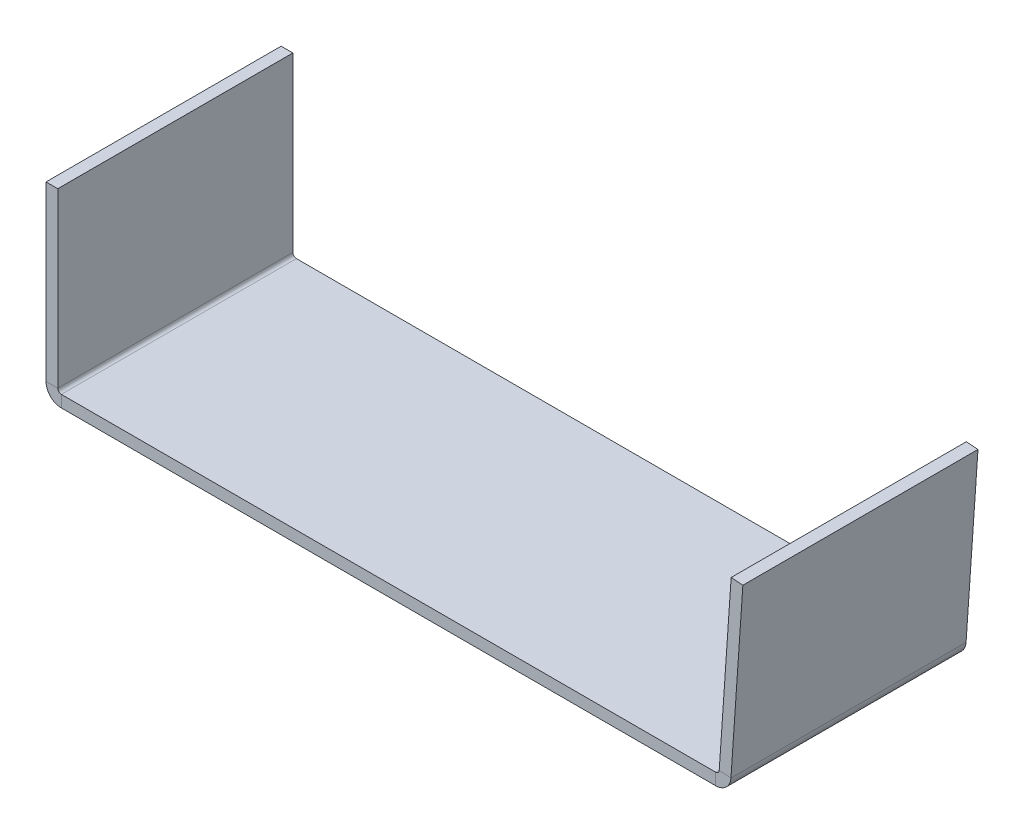
ISO-10303-21;
HEADER;
FILE_DESCRIPTION(('STEP AP214'),'2;1');
FILE_NAME('part.step','',(''),(''),'','','');
FILE_SCHEMA(('AUTOMOTIVE_DESIGN { 1 0 10303 214 1 1 1 1 }'));
ENDSEC;
DATA;
#1=APPLICATION_CONTEXT('core data for automotive mechanical design processes');
#2=APPLICATION_PROTOCOL_DEFINITION('international standard','automotive_design',2000,#1);
#3=PRODUCT_CONTEXT('',#1,'mechanical');
#4=PRODUCT('Part','Part','',(#3));
#5=PRODUCT_RELATED_PRODUCT_CATEGORY('part','',(#4));
#6=PRODUCT_DEFINITION_FORMATION('','',#4);
#7=PRODUCT_DEFINITION_CONTEXT('part definition',#1,'design');
#8=PRODUCT_DEFINITION('design','',#6,#7);
#9=PRODUCT_DEFINITION_SHAPE('','',#8);
#10=(LENGTH_UNIT() NAMED_UNIT(*) SI_UNIT(.MILLI.,.METRE.));
#11=(NAMED_UNIT(*) PLANE_ANGLE_UNIT() SI_UNIT($,.RADIAN.));
#12=(NAMED_UNIT(*) SI_UNIT($,.STERADIAN.) SOLID_ANGLE_UNIT());
#13=UNCERTAINTY_MEASURE_WITH_UNIT(LENGTH_MEASURE(1.E-05),#10,'distance_accuracy_value','');
#14=(GEOMETRIC_REPRESENTATION_CONTEXT(3) GLOBAL_UNCERTAINTY_ASSIGNED_CONTEXT((#13)) GLOBAL_UNIT_ASSIGNED_CONTEXT((#10,
#11,#12)) REPRESENTATION_CONTEXT('',''));
#15=CARTESIAN_POINT('',(0.,0.,0.));
#16=DIRECTION('',(0.,0.,1.));
#17=DIRECTION('',(1.,0.,0.));
#18=AXIS2_PLACEMENT_3D('',#15,#16,#17);
#19=CARTESIAN_POINT('',(-57.5817896648977,2.3272715865959,40.));
#20=DIRECTION('',(0.,0.,1.));
#21=DIRECTION('',(1.,0.,0.));
#22=AXIS2_PLACEMENT_3D('',#19,#20,#21);
#23=PLANE('',#22);
#24=DIRECTION('',(0.,-1.,0.));
#25=VECTOR('',#24,1.);
#26=CARTESIAN_POINT('',(-57.5817896648977,2.3272715865959,40.));
#27=LINE('',#26,#25);
#28=CARTESIAN_POINT('',(-57.5817896648977,2.3272715865959,40.));
#29=VERTEX_POINT('',#28);
#30=CARTESIAN_POINT('',(-57.5817896648977,0.327271586595903,40.));
#31=VERTEX_POINT('',#30);
#32=EDGE_CURVE('E11',#29,#31,#27,.T.);
#33=ORIENTED_EDGE('',*,*,#32,.F.);
#34=CARTESIAN_POINT('',(-57.5817896648977,2.92727158659591,40.));
#35=DIRECTION('',(0.,0.,-1.));
#36=DIRECTION('',(-1.,0.,0.));
#37=AXIS2_PLACEMENT_3D('',#34,#35,#36);
#38=CIRCLE('',#37,0.6);
#39=CARTESIAN_POINT('',(-58.1817896648977,2.92727158659592,40.));
#40=VERTEX_POINT('',#39);
#41=EDGE_CURVE('E249',#40,#29,#38,.F.);
#42=ORIENTED_EDGE('',*,*,#41,.F.);
#43=DIRECTION('',(1.,0.,0.));
#44=VECTOR('',#43,1.);
#45=CARTESIAN_POINT('',(-60.1817896648977,2.92727158659597,40.));
#46=LINE('',#45,#44);
#47=CARTESIAN_POINT('',(-60.1817896648977,2.92727158659597,40.));
#48=VERTEX_POINT('',#47);
#49=EDGE_CURVE('E47',#48,#40,#46,.T.);
#50=ORIENTED_EDGE('',*,*,#49,.F.);
#51=CARTESIAN_POINT('',(-57.5817896648977,2.92727158659591,40.));
#52=DIRECTION('',(0.,0.,1.));
#53=DIRECTION('',(1.,0.,0.));
#54=AXIS2_PLACEMENT_3D('',#51,#52,#53);
#55=CIRCLE('',#54,2.6);
#56=EDGE_CURVE('E148',#48,#31,#55,.T.);
#57=ORIENTED_EDGE('',*,*,#56,.T.);
#58=EDGE_LOOP('',(#33,#42,#50,#57));
#59=FACE_BOUND('',#58,.T.);
#60=ADVANCED_FACE('F39',(#59),#23,.T.);
#61=CARTESIAN_POINT('',(-60.1817896648977,2.92727158659597,40.));
#62=DIRECTION('',(0.,0.,1.));
#63=DIRECTION('',(1.,0.,0.));
#64=AXIS2_PLACEMENT_3D('',#61,#62,#63);
#65=PLANE('',#64);
#66=DIRECTION('',(1.,0.,0.));
#67=VECTOR('',#66,1.);
#68=CARTESIAN_POINT('',(-58.1817896648977,2.3272715865959,40.));
#69=LINE('',#68,#67);
#70=CARTESIAN_POINT('',(53.7429578174275,2.3272715865959,40.));
#71=VERTEX_POINT('',#70);
#72=EDGE_CURVE('E142',#29,#71,#69,.T.);
#73=ORIENTED_EDGE('',*,*,#72,.F.);
#74=ORIENTED_EDGE('',*,*,#32,.T.);
#75=DIRECTION('',(1.,0.,0.));
#76=VECTOR('',#75,1.);
#77=CARTESIAN_POINT('',(-58.1817896648977,0.327271586595903,40.));
#78=LINE('',#77,#76);
#79=CARTESIAN_POINT('',(53.7429578174275,0.327271586595903,40.));
#80=VERTEX_POINT('',#79);
#81=EDGE_CURVE('E139',#31,#80,#78,.T.);
#82=ORIENTED_EDGE('',*,*,#81,.T.);
#83=DIRECTION('',(0.,1.,0.));
#84=VECTOR('',#83,1.);
#85=CARTESIAN_POINT('',(53.7429578174275,0.327271586595903,40.));
#86=LINE('',#85,#84);
#87=EDGE_CURVE('E230',#80,#71,#86,.T.);
#88=ORIENTED_EDGE('',*,*,#87,.T.);
#89=EDGE_LOOP('',(#73,#74,#82,#88));
#90=FACE_BOUND('',#89,.T.);
#91=ADVANCED_FACE('F137',(#90),#65,.T.);
#92=CARTESIAN_POINT('',(-58.1817896648977,2.92727158659592,0.));
#93=DIRECTION('',(0.,0.,-1.));
#94=DIRECTION('',(-1.,0.,0.));
#95=AXIS2_PLACEMENT_3D('',#92,#93,#94);
#96=PLANE('',#95);
#97=DIRECTION('',(-1.,0.,0.));
#98=VECTOR('',#97,1.);
#99=CARTESIAN_POINT('',(-58.1817896648977,2.92727158659592,0.));
#100=LINE('',#99,#98);
#101=CARTESIAN_POINT('',(-58.1817896648977,2.92727158659592,0.));
#102=VERTEX_POINT('',#101);
#103=CARTESIAN_POINT('',(-60.1817896648977,2.92727158659597,0.));
#104=VERTEX_POINT('',#103);
#105=EDGE_CURVE('E235',#102,#104,#100,.T.);
#106=ORIENTED_EDGE('',*,*,#105,.F.);
#107=CARTESIAN_POINT('',(-57.5817896648977,2.92727158659591,0.));
#108=DIRECTION('',(0.,0.,-1.));
#109=DIRECTION('',(-1.,0.,0.));
#110=AXIS2_PLACEMENT_3D('',#107,#108,#109);
#111=CIRCLE('',#110,0.6);
#112=CARTESIAN_POINT('',(-57.5817896648977,2.3272715865959,0.));
#113=VERTEX_POINT('',#112);
#114=EDGE_CURVE('E187',#102,#113,#111,.F.);
#115=ORIENTED_EDGE('',*,*,#114,.T.);
#116=DIRECTION('',(0.,1.,0.));
#117=VECTOR('',#116,1.);
#118=CARTESIAN_POINT('',(-57.5817896648977,0.327271586595903,0.));
#119=LINE('',#118,#117);
#120=CARTESIAN_POINT('',(-57.5817896648977,0.327271586595903,0.));
#121=VERTEX_POINT('',#120);
#122=EDGE_CURVE('E233',#121,#113,#119,.T.);
#123=ORIENTED_EDGE('',*,*,#122,.F.);
#124=CARTESIAN_POINT('',(-57.5817896648977,2.92727158659591,0.));
#125=DIRECTION('',(0.,0.,1.));
#126=DIRECTION('',(1.,0.,0.));
#127=AXIS2_PLACEMENT_3D('',#124,#125,#126);
#128=CIRCLE('',#127,2.6);
#129=EDGE_CURVE('E160',#104,#121,#128,.T.);
#130=ORIENTED_EDGE('',*,*,#129,.F.);
#131=EDGE_LOOP('',(#106,#115,#123,#130));
#132=FACE_BOUND('',#131,.T.);
#133=ADVANCED_FACE('F287',(#132),#96,.T.);
#134=CARTESIAN_POINT('',(-57.5817896648977,0.327271586595903,0.));
#135=DIRECTION('',(0.,0.,-1.));
#136=DIRECTION('',(-1.,0.,0.));
#137=AXIS2_PLACEMENT_3D('',#134,#135,#136);
#138=PLANE('',#137);
#139=DIRECTION('',(0.,-1.,0.));
#140=VECTOR('',#139,1.);
#141=CARTESIAN_POINT('',(-58.1817896648977,32.3232164804987,0.));
#142=LINE('',#141,#140);
#143=CARTESIAN_POINT('',(-58.1817896648977,32.3232164804987,0.));
#144=VERTEX_POINT('',#143);
#145=EDGE_CURVE('E190',#144,#102,#142,.T.);
#146=ORIENTED_EDGE('',*,*,#145,.T.);
#147=ORIENTED_EDGE('',*,*,#105,.T.);
#148=DIRECTION('',(0.,1.,0.));
#149=VECTOR('',#148,1.);
#150=CARTESIAN_POINT('',(-60.1817896648977,32.3232164804987,0.));
#151=LINE('',#150,#149);
#152=CARTESIAN_POINT('',(-60.1817896648977,32.3232164804987,0.));
#153=VERTEX_POINT('',#152);
#154=EDGE_CURVE('E196',#153,#104,#151,.F.);
#155=ORIENTED_EDGE('',*,*,#154,.F.);
#156=DIRECTION('',(1.,0.,0.));
#157=VECTOR('',#156,1.);
#158=CARTESIAN_POINT('',(-60.1817896648977,32.3232164804987,0.));
#159=LINE('',#158,#157);
#160=EDGE_CURVE('E193',#153,#144,#159,.T.);
#161=ORIENTED_EDGE('',*,*,#160,.T.);
#162=EDGE_LOOP('',(#146,#147,#155,#161));
#163=FACE_BOUND('',#162,.T.);
#164=ADVANCED_FACE('F290',(#163),#138,.T.);
#165=CARTESIAN_POINT('',(54.3415360144813,2.88599033162667,40.));
#166=DIRECTION('',(0.,0.,1.));
#167=DIRECTION('',(1.,0.,0.));
#168=AXIS2_PLACEMENT_3D('',#165,#166,#167);
#169=PLANE('',#168);
#170=DIRECTION('',(0.997630328422983,-0.0688020916153791,0.));
#171=VECTOR('',#170,1.);
#172=CARTESIAN_POINT('',(54.3415360144813,2.88599033162667,40.));
#173=LINE('',#172,#171);
#174=CARTESIAN_POINT('',(54.3415360144813,2.88599033162667,40.));
#175=VERTEX_POINT('',#174);
#176=CARTESIAN_POINT('',(56.3367966713273,2.74838614839592,40.));
#177=VERTEX_POINT('',#176);
#178=EDGE_CURVE('E55',#175,#177,#173,.T.);
#179=ORIENTED_EDGE('',*,*,#178,.F.);
#180=CARTESIAN_POINT('',(53.7429578174275,2.9272715865959,40.));
#181=DIRECTION('',(0.,0.,-1.));
#182=DIRECTION('',(-1.,0.,0.));
#183=AXIS2_PLACEMENT_3D('',#180,#181,#182);
#184=CIRCLE('',#183,0.6);
#185=EDGE_CURVE('E259',#71,#175,#184,.F.);
#186=ORIENTED_EDGE('',*,*,#185,.F.);
#187=ORIENTED_EDGE('',*,*,#87,.F.);
#188=CARTESIAN_POINT('',(53.7429578174275,2.9272715865959,40.));
#189=DIRECTION('',(0.,0.,1.));
#190=DIRECTION('',(1.,0.,0.));
#191=AXIS2_PLACEMENT_3D('',#188,#189,#190);
#192=CIRCLE('',#191,2.6);
#193=EDGE_CURVE('E168',#80,#177,#192,.T.);
#194=ORIENTED_EDGE('',*,*,#193,.T.);
#195=EDGE_LOOP('',(#179,#186,#187,#194));
#196=FACE_BOUND('',#195,.T.);
#197=ADVANCED_FACE('F282',(#196),#169,.T.);
#198=CARTESIAN_POINT('',(53.7429578174275,0.327271586595903,40.));
#199=DIRECTION('',(0.,0.,1.));
#200=DIRECTION('',(1.,0.,0.));
#201=AXIS2_PLACEMENT_3D('',#198,#199,#200);
#202=PLANE('',#201);
#203=DIRECTION('',(0.0688020916153792,0.997630328422983,0.));
#204=VECTOR('',#203,1.);
#205=CARTESIAN_POINT('',(54.3030036872378,2.3272715865959,40.));
#206=LINE('',#205,#204);
#207=CARTESIAN_POINT('',(56.3716895419898,32.3232164804987,40.));
#208=VERTEX_POINT('',#207);
#209=EDGE_CURVE('E262',#175,#208,#206,.T.);
#210=ORIENTED_EDGE('',*,*,#209,.F.);
#211=ORIENTED_EDGE('',*,*,#178,.T.);
#212=DIRECTION('',(0.0688020916153792,0.997630328422983,0.));
#213=VECTOR('',#212,1.);
#214=CARTESIAN_POINT('',(56.2982643440838,2.18966740336514,40.));
#215=LINE('',#214,#213);
#216=CARTESIAN_POINT('',(58.3669501988357,32.1856122972679,40.));
#217=VERTEX_POINT('',#216);
#218=EDGE_CURVE('E109',#177,#217,#215,.T.);
#219=ORIENTED_EDGE('',*,*,#218,.T.);
#220=DIRECTION('',(0.997630328422983,-0.0688020916153783,0.));
#221=VECTOR('',#220,1.);
#222=CARTESIAN_POINT('',(56.3716895419898,32.3232164804987,40.));
#223=LINE('',#222,#221);
#224=EDGE_CURVE('E265',#208,#217,#223,.T.);
#225=ORIENTED_EDGE('',*,*,#224,.F.);
#226=EDGE_LOOP('',(#210,#211,#219,#225));
#227=FACE_BOUND('',#226,.T.);
#228=ADVANCED_FACE('F271',(#227),#202,.T.);
#229=CARTESIAN_POINT('',(53.7429578174275,2.3272715865959,0.));
#230=DIRECTION('',(0.,0.,-1.));
#231=DIRECTION('',(-1.,0.,0.));
#232=AXIS2_PLACEMENT_3D('',#229,#230,#231);
#233=PLANE('',#232);
#234=DIRECTION('',(0.,-1.,0.));
#235=VECTOR('',#234,1.);
#236=CARTESIAN_POINT('',(53.7429578174275,2.3272715865959,0.));
#237=LINE('',#236,#235);
#238=CARTESIAN_POINT('',(53.7429578174275,2.3272715865959,0.));
#239=VERTEX_POINT('',#238);
#240=CARTESIAN_POINT('',(53.7429578174275,0.327271586595903,0.));
#241=VERTEX_POINT('',#240);
#242=EDGE_CURVE('E96',#239,#241,#237,.T.);
#243=ORIENTED_EDGE('',*,*,#242,.F.);
#244=CARTESIAN_POINT('',(53.7429578174275,2.9272715865959,0.));
#245=DIRECTION('',(0.,0.,-1.));
#246=DIRECTION('',(-1.,0.,0.));
#247=AXIS2_PLACEMENT_3D('',#244,#245,#246);
#248=CIRCLE('',#247,0.6);
#249=CARTESIAN_POINT('',(54.3415360144813,2.88599033162667,0.));
#250=VERTEX_POINT('',#249);
#251=EDGE_CURVE('E183',#239,#250,#248,.F.);
#252=ORIENTED_EDGE('',*,*,#251,.T.);
#253=DIRECTION('',(-0.997630328422983,0.0688020916153791,0.));
#254=VECTOR('',#253,1.);
#255=CARTESIAN_POINT('',(56.3367966713273,2.74838614839592,0.));
#256=LINE('',#255,#254);
#257=CARTESIAN_POINT('',(56.3367966713273,2.74838614839592,0.));
#258=VERTEX_POINT('',#257);
#259=EDGE_CURVE('E103',#258,#250,#256,.T.);
#260=ORIENTED_EDGE('',*,*,#259,.F.);
#261=CARTESIAN_POINT('',(53.7429578174275,2.9272715865959,0.));
#262=DIRECTION('',(0.,0.,1.));
#263=DIRECTION('',(1.,0.,0.));
#264=AXIS2_PLACEMENT_3D('',#261,#262,#263);
#265=CIRCLE('',#264,2.6);
#266=EDGE_CURVE('E202',#241,#258,#265,.T.);
#267=ORIENTED_EDGE('',*,*,#266,.F.);
#268=EDGE_LOOP('',(#243,#252,#260,#267));
#269=FACE_BOUND('',#268,.T.);
#270=ADVANCED_FACE('F319',(#269),#233,.T.);
#271=CARTESIAN_POINT('',(56.3367966713273,2.74838614839592,0.));
#272=DIRECTION('',(0.,0.,-1.));
#273=DIRECTION('',(-1.,0.,0.));
#274=AXIS2_PLACEMENT_3D('',#271,#272,#273);
#275=PLANE('',#274);
#276=DIRECTION('',(1.,0.,0.));
#277=VECTOR('',#276,1.);
#278=CARTESIAN_POINT('',(-58.1817896648977,2.3272715865959,0.));
#279=LINE('',#278,#277);
#280=EDGE_CURVE('E185',#113,#239,#279,.T.);
#281=ORIENTED_EDGE('',*,*,#280,.T.);
#282=ORIENTED_EDGE('',*,*,#242,.T.);
#283=DIRECTION('',(1.,0.,0.));
#284=VECTOR('',#283,1.);
#285=CARTESIAN_POINT('',(-58.1817896648977,0.327271586595903,0.));
#286=LINE('',#285,#284);
#287=EDGE_CURVE('E200',#121,#241,#286,.T.);
#288=ORIENTED_EDGE('',*,*,#287,.F.);
#289=ORIENTED_EDGE('',*,*,#122,.T.);
#290=EDGE_LOOP('',(#281,#282,#288,#289));
#291=FACE_BOUND('',#290,.T.);
#292=ADVANCED_FACE('F322',(#291),#275,.T.);
#293=CARTESIAN_POINT('',(56.2982643440838,2.18966740336514,40.));
#294=DIRECTION('',(-0.997630328422983,0.0688020916153792,0.));
#295=DIRECTION('',(-0.0688020916153792,-0.997630328422983,0.));
#296=AXIS2_PLACEMENT_3D('',#293,#294,#295);
#297=PLANE('',#296);
#298=DIRECTION('',(0.0688020916153792,0.997630328422983,0.));
#299=VECTOR('',#298,1.);
#300=CARTESIAN_POINT('',(56.2982643440838,2.18966740336514,0.));
#301=LINE('',#300,#299);
#302=CARTESIAN_POINT('',(58.3669501988357,32.1856122972679,0.));
#303=VERTEX_POINT('',#302);
#304=EDGE_CURVE('E174',#258,#303,#301,.T.);
#305=ORIENTED_EDGE('',*,*,#304,.T.);
#306=DIRECTION('',(0.,0.,-1.));
#307=VECTOR('',#306,1.);
#308=CARTESIAN_POINT('',(58.3669501988357,32.1856122972679,40.));
#309=LINE('',#308,#307);
#310=EDGE_CURVE('E226',#217,#303,#309,.T.);
#311=ORIENTED_EDGE('',*,*,#310,.F.);
#312=ORIENTED_EDGE('',*,*,#218,.F.);
#313=DIRECTION('',(0.,0.,-1.));
#314=VECTOR('',#313,1.);
#315=CARTESIAN_POINT('',(56.3367966713273,2.74838614839592,40.));
#316=LINE('',#315,#314);
#317=EDGE_CURVE('E170',#177,#258,#316,.T.);
#318=ORIENTED_EDGE('',*,*,#317,.T.);
#319=EDGE_LOOP('',(#305,#311,#312,#318));
#320=FACE_BOUND('',#319,.T.);
#321=ADVANCED_FACE('F325',(#320),#297,.F.);
#322=CARTESIAN_POINT('',(56.3716895419898,32.3232164804987,40.));
#323=DIRECTION('',(0.0688020916153783,0.997630328422983,0.));
#324=DIRECTION('',(-0.997630328422983,0.0688020916153783,0.));
#325=AXIS2_PLACEMENT_3D('',#322,#323,#324);
#326=PLANE('',#325);
#327=DIRECTION('',(0.997630328422983,-0.0688020916153783,0.));
#328=VECTOR('',#327,1.);
#329=CARTESIAN_POINT('',(56.3716895419898,32.3232164804987,0.));
#330=LINE('',#329,#328);
#331=CARTESIAN_POINT('',(56.3716895419898,32.3232164804987,0.));
#332=VERTEX_POINT('',#331);
#333=EDGE_CURVE('E177',#332,#303,#330,.T.);
#334=ORIENTED_EDGE('',*,*,#333,.F.);
#335=DIRECTION('',(0.,0.,-1.));
#336=VECTOR('',#335,1.);
#337=CARTESIAN_POINT('',(56.3716895419898,32.3232164804987,40.));
#338=LINE('',#337,#336);
#339=EDGE_CURVE('E224',#208,#332,#338,.T.);
#340=ORIENTED_EDGE('',*,*,#339,.F.);
#341=ORIENTED_EDGE('',*,*,#224,.T.);
#342=ORIENTED_EDGE('',*,*,#310,.T.);
#343=EDGE_LOOP('',(#334,#340,#341,#342));
#344=FACE_BOUND('',#343,.T.);
#345=ADVANCED_FACE('F270',(#344),#326,.T.);
#346=CARTESIAN_POINT('',(54.3030036872378,2.3272715865959,40.));
#347=DIRECTION('',(-0.997630328422983,0.0688020916153793,0.));
#348=DIRECTION('',(-0.0688020916153793,-0.997630328422983,0.));
#349=AXIS2_PLACEMENT_3D('',#346,#347,#348);
#350=PLANE('',#349);
#351=DIRECTION('',(0.0688020916153792,0.997630328422983,0.));
#352=VECTOR('',#351,1.);
#353=CARTESIAN_POINT('',(54.3030036872378,2.3272715865959,0.));
#354=LINE('',#353,#352);
#355=EDGE_CURVE('E180',#250,#332,#354,.T.);
#356=ORIENTED_EDGE('',*,*,#355,.F.);
#357=DIRECTION('',(0.,0.,-1.));
#358=VECTOR('',#357,1.);
#359=CARTESIAN_POINT('',(54.3415360144813,2.88599033162667,40.));
#360=LINE('',#359,#358);
#361=EDGE_CURVE('E221',#175,#250,#360,.T.);
#362=ORIENTED_EDGE('',*,*,#361,.F.);
#363=ORIENTED_EDGE('',*,*,#209,.T.);
#364=ORIENTED_EDGE('',*,*,#339,.T.);
#365=EDGE_LOOP('',(#356,#362,#363,#364));
#366=FACE_BOUND('',#365,.T.);
#367=ADVANCED_FACE('F275',(#366),#350,.T.);
#368=CARTESIAN_POINT('',(53.7429578174275,2.9272715865959,40.));
#369=DIRECTION('',(0.,0.,-1.));
#370=DIRECTION('',(-1.,0.,0.));
#371=AXIS2_PLACEMENT_3D('',#368,#369,#370);
#372=CYLINDRICAL_SURFACE('',#371,0.6);
#373=ORIENTED_EDGE('',*,*,#251,.F.);
#374=DIRECTION('',(0.,0.,-1.));
#375=VECTOR('',#374,1.);
#376=CARTESIAN_POINT('',(53.7429578174275,2.3272715865959,40.));
#377=LINE('',#376,#375);
#378=EDGE_CURVE('E218',#71,#239,#377,.T.);
#379=ORIENTED_EDGE('',*,*,#378,.F.);
#380=ORIENTED_EDGE('',*,*,#185,.T.);
#381=ORIENTED_EDGE('',*,*,#361,.T.);
#382=EDGE_LOOP('',(#373,#379,#380,#381));
#383=FACE_BOUND('',#382,.T.);
#384=ADVANCED_FACE('F278',(#383),#372,.F.);
#385=CARTESIAN_POINT('',(-58.1817896648977,2.3272715865959,40.));
#386=DIRECTION('',(0.,1.,0.));
#387=DIRECTION('',(0.,0.,1.));
#388=AXIS2_PLACEMENT_3D('',#385,#386,#387);
#389=PLANE('',#388);
#390=ORIENTED_EDGE('',*,*,#280,.F.);
#391=DIRECTION('',(0.,0.,-1.));
#392=VECTOR('',#391,1.);
#393=CARTESIAN_POINT('',(-57.5817896648977,2.3272715865959,40.));
#394=LINE('',#393,#392);
#395=EDGE_CURVE('E215',#29,#113,#394,.T.);
#396=ORIENTED_EDGE('',*,*,#395,.F.);
#397=ORIENTED_EDGE('',*,*,#72,.T.);
#398=ORIENTED_EDGE('',*,*,#378,.T.);
#399=EDGE_LOOP('',(#390,#396,#397,#398));
#400=FACE_BOUND('',#399,.T.);
#401=ADVANCED_FACE('F285',(#400),#389,.T.);
#402=CARTESIAN_POINT('',(-57.5817896648977,2.92727158659591,40.));
#403=DIRECTION('',(0.,0.,-1.));
#404=DIRECTION('',(-1.,0.,0.));
#405=AXIS2_PLACEMENT_3D('',#402,#403,#404);
#406=CYLINDRICAL_SURFACE('',#405,0.6);
#407=ORIENTED_EDGE('',*,*,#114,.F.);
#408=DIRECTION('',(0.,0.,-1.));
#409=VECTOR('',#408,1.);
#410=CARTESIAN_POINT('',(-58.1817896648977,2.92727158659592,40.));
#411=LINE('',#410,#409);
#412=EDGE_CURVE('E212',#40,#102,#411,.T.);
#413=ORIENTED_EDGE('',*,*,#412,.F.);
#414=ORIENTED_EDGE('',*,*,#41,.T.);
#415=ORIENTED_EDGE('',*,*,#395,.T.);
#416=EDGE_LOOP('',(#407,#413,#414,#415));
#417=FACE_BOUND('',#416,.T.);
#418=ADVANCED_FACE('F248',(#417),#406,.F.);
#419=CARTESIAN_POINT('',(-58.1817896648977,32.3232164804987,40.));
#420=DIRECTION('',(1.,0.,0.));
#421=DIRECTION('',(0.,0.,-1.));
#422=AXIS2_PLACEMENT_3D('',#419,#420,#421);
#423=PLANE('',#422);
#424=ORIENTED_EDGE('',*,*,#145,.F.);
#425=DIRECTION('',(0.,0.,-1.));
#426=VECTOR('',#425,1.);
#427=CARTESIAN_POINT('',(-58.1817896648977,32.3232164804987,40.));
#428=LINE('',#427,#426);
#429=CARTESIAN_POINT('',(-58.1817896648977,32.3232164804987,40.));
#430=VERTEX_POINT('',#429);
#431=EDGE_CURVE('E210',#430,#144,#428,.T.);
#432=ORIENTED_EDGE('',*,*,#431,.F.);
#433=DIRECTION('',(0.,-1.,0.));
#434=VECTOR('',#433,1.);
#435=CARTESIAN_POINT('',(-58.1817896648977,32.3232164804987,40.));
#436=LINE('',#435,#434);
#437=EDGE_CURVE('E242',#430,#40,#436,.T.);
#438=ORIENTED_EDGE('',*,*,#437,.T.);
#439=ORIENTED_EDGE('',*,*,#412,.T.);
#440=EDGE_LOOP('',(#424,#432,#438,#439));
#441=FACE_BOUND('',#440,.T.);
#442=ADVANCED_FACE('F253',(#441),#423,.T.);
#443=CARTESIAN_POINT('',(-60.1817896648977,32.3232164804987,40.));
#444=DIRECTION('',(0.,1.,0.));
#445=DIRECTION('',(0.,0.,1.));
#446=AXIS2_PLACEMENT_3D('',#443,#444,#445);
#447=PLANE('',#446);
#448=ORIENTED_EDGE('',*,*,#160,.F.);
#449=DIRECTION('',(0.,0.,-1.));
#450=VECTOR('',#449,1.);
#451=CARTESIAN_POINT('',(-60.1817896648977,32.3232164804987,40.));
#452=LINE('',#451,#450);
#453=CARTESIAN_POINT('',(-60.1817896648977,32.3232164804987,40.));
#454=VERTEX_POINT('',#453);
#455=EDGE_CURVE('E208',#454,#153,#452,.T.);
#456=ORIENTED_EDGE('',*,*,#455,.F.);
#457=DIRECTION('',(1.,0.,0.));
#458=VECTOR('',#457,1.);
#459=CARTESIAN_POINT('',(-60.1817896648977,32.3232164804987,40.));
#460=LINE('',#459,#458);
#461=EDGE_CURVE('E254',#454,#430,#460,.T.);
#462=ORIENTED_EDGE('',*,*,#461,.T.);
#463=ORIENTED_EDGE('',*,*,#431,.T.);
#464=EDGE_LOOP('',(#448,#456,#462,#463));
#465=FACE_BOUND('',#464,.T.);
#466=ADVANCED_FACE('F295',(#465),#447,.T.);
#467=CARTESIAN_POINT('',(-60.1817896648977,32.3232164804987,40.));
#468=DIRECTION('',(1.,0.,0.));
#469=DIRECTION('',(0.,0.,-1.));
#470=AXIS2_PLACEMENT_3D('',#467,#468,#469);
#471=PLANE('',#470);
#472=ORIENTED_EDGE('',*,*,#154,.T.);
#473=DIRECTION('',(0.,0.,-1.));
#474=VECTOR('',#473,1.);
#475=CARTESIAN_POINT('',(-60.1817896648977,2.92727158659597,40.));
#476=LINE('',#475,#474);
#477=EDGE_CURVE('E162',#48,#104,#476,.T.);
#478=ORIENTED_EDGE('',*,*,#477,.F.);
#479=DIRECTION('',(0.,1.,0.));
#480=VECTOR('',#479,1.);
#481=CARTESIAN_POINT('',(-60.1817896648977,32.3232164804987,40.));
#482=LINE('',#481,#480);
#483=EDGE_CURVE('E153',#454,#48,#482,.F.);
#484=ORIENTED_EDGE('',*,*,#483,.F.);
#485=ORIENTED_EDGE('',*,*,#455,.T.);
#486=EDGE_LOOP('',(#472,#478,#484,#485));
#487=FACE_BOUND('',#486,.T.);
#488=ADVANCED_FACE('F293',(#487),#471,.F.);
#489=CARTESIAN_POINT('',(-57.5817896648977,2.92727158659591,40.));
#490=DIRECTION('',(0.,0.,-1.));
#491=DIRECTION('',(-1.,0.,0.));
#492=AXIS2_PLACEMENT_3D('',#489,#490,#491);
#493=CYLINDRICAL_SURFACE('',#492,2.6);
#494=ORIENTED_EDGE('',*,*,#129,.T.);
#495=DIRECTION('',(0.,0.,-1.));
#496=VECTOR('',#495,1.);
#497=CARTESIAN_POINT('',(-57.5817896648977,0.327271586595903,40.));
#498=LINE('',#497,#496);
#499=EDGE_CURVE('E157',#31,#121,#498,.T.);
#500=ORIENTED_EDGE('',*,*,#499,.F.);
#501=ORIENTED_EDGE('',*,*,#56,.F.);
#502=ORIENTED_EDGE('',*,*,#477,.T.);
#503=EDGE_LOOP('',(#494,#500,#501,#502));
#504=FACE_BOUND('',#503,.T.);
#505=ADVANCED_FACE('F158',(#504),#493,.T.);
#506=CARTESIAN_POINT('',(-58.1817896648977,0.327271586595903,40.));
#507=DIRECTION('',(0.,1.,0.));
#508=DIRECTION('',(0.,0.,1.));
#509=AXIS2_PLACEMENT_3D('',#506,#507,#508);
#510=PLANE('',#509);
#511=ORIENTED_EDGE('',*,*,#287,.T.);
#512=DIRECTION('',(0.,0.,-1.));
#513=VECTOR('',#512,1.);
#514=CARTESIAN_POINT('',(53.7429578174275,0.327271586595903,40.));
#515=LINE('',#514,#513);
#516=EDGE_CURVE('E163',#80,#241,#515,.T.);
#517=ORIENTED_EDGE('',*,*,#516,.F.);
#518=ORIENTED_EDGE('',*,*,#81,.F.);
#519=ORIENTED_EDGE('',*,*,#499,.T.);
#520=EDGE_LOOP('',(#511,#517,#518,#519));
#521=FACE_BOUND('',#520,.T.);
#522=ADVANCED_FACE('F165',(#521),#510,.F.);
#523=CARTESIAN_POINT('',(53.7429578174275,2.9272715865959,40.));
#524=DIRECTION('',(0.,0.,-1.));
#525=DIRECTION('',(-1.,0.,0.));
#526=AXIS2_PLACEMENT_3D('',#523,#524,#525);
#527=CYLINDRICAL_SURFACE('',#526,2.6);
#528=ORIENTED_EDGE('',*,*,#266,.T.);
#529=ORIENTED_EDGE('',*,*,#317,.F.);
#530=ORIENTED_EDGE('',*,*,#193,.F.);
#531=ORIENTED_EDGE('',*,*,#516,.T.);
#532=EDGE_LOOP('',(#528,#529,#530,#531));
#533=FACE_BOUND('',#532,.T.);
#534=ADVANCED_FACE('F377',(#533),#527,.T.);
#535=CARTESIAN_POINT('',(53.7429578174275,2.9272715865959,40.));
#536=DIRECTION('',(0.,0.,-1.));
#537=DIRECTION('',(-1.,0.,0.));
#538=AXIS2_PLACEMENT_3D('',#535,#536,#537);
#539=PLANE('',#538);
#540=ORIENTED_EDGE('',*,*,#483,.T.);
#541=ORIENTED_EDGE('',*,*,#49,.T.);
#542=ORIENTED_EDGE('',*,*,#437,.F.);
#543=ORIENTED_EDGE('',*,*,#461,.F.);
#544=EDGE_LOOP('',(#540,#541,#542,#543));
#545=FACE_BOUND('',#544,.T.);
#546=ADVANCED_FACE('F239',(#545),#539,.F.);
#547=CARTESIAN_POINT('',(53.7429578174275,2.9272715865959,0.));
#548=DIRECTION('',(0.,0.,-1.));
#549=DIRECTION('',(-1.,0.,0.));
#550=AXIS2_PLACEMENT_3D('',#547,#548,#549);
#551=PLANE('',#550);
#552=ORIENTED_EDGE('',*,*,#304,.F.);
#553=ORIENTED_EDGE('',*,*,#259,.T.);
#554=ORIENTED_EDGE('',*,*,#355,.T.);
#555=ORIENTED_EDGE('',*,*,#333,.T.);
#556=EDGE_LOOP('',(#552,#553,#554,#555));
#557=FACE_BOUND('',#556,.T.);
#558=ADVANCED_FACE('F397',(#557),#551,.T.);
#559=CLOSED_SHELL('',(#60,#91,#133,#164,#197,#228,#270,#292,#321,#345,#367,#384,#401,#418,#442,
#466,#488,#505,#522,#534,#546,#558));
#560=MANIFOLD_SOLID_BREP('B2',#559);
#561=ADVANCED_BREP_SHAPE_REPRESENTATION('',(#18,#560),#14);
#562=SHAPE_DEFINITION_REPRESENTATION(#9,#561);
ENDSEC;
END-ISO-10303-21;
